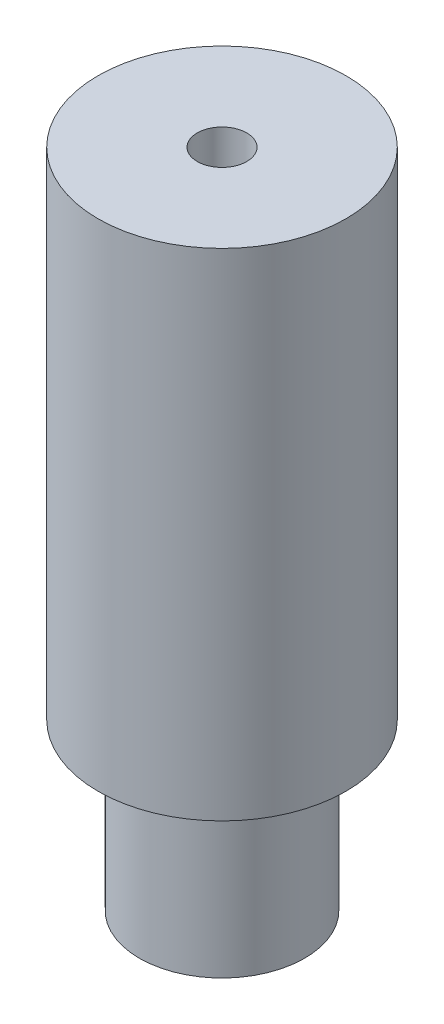
ISO-10303-21;
HEADER;
FILE_DESCRIPTION(('STEP AP214'),'2;1');
FILE_NAME('part.step','',(''),(''),'','','');
FILE_SCHEMA(('AUTOMOTIVE_DESIGN { 1 0 10303 214 1 1 1 1 }'));
ENDSEC;
DATA;
#1=APPLICATION_CONTEXT('core data for automotive mechanical design processes');
#2=APPLICATION_PROTOCOL_DEFINITION('international standard','automotive_design',2000,#1);
#3=PRODUCT_CONTEXT('',#1,'mechanical');
#4=PRODUCT('Part','Part','',(#3));
#5=PRODUCT_RELATED_PRODUCT_CATEGORY('part','',(#4));
#6=PRODUCT_DEFINITION_FORMATION('','',#4);
#7=PRODUCT_DEFINITION_CONTEXT('part definition',#1,'design');
#8=PRODUCT_DEFINITION('design','',#6,#7);
#9=PRODUCT_DEFINITION_SHAPE('','',#8);
#10=(LENGTH_UNIT() NAMED_UNIT(*) SI_UNIT(.MILLI.,.METRE.));
#11=(NAMED_UNIT(*) PLANE_ANGLE_UNIT() SI_UNIT($,.RADIAN.));
#12=(NAMED_UNIT(*) SI_UNIT($,.STERADIAN.) SOLID_ANGLE_UNIT());
#13=UNCERTAINTY_MEASURE_WITH_UNIT(LENGTH_MEASURE(1.E-05),#10,'distance_accuracy_value','');
#14=(GEOMETRIC_REPRESENTATION_CONTEXT(3) GLOBAL_UNCERTAINTY_ASSIGNED_CONTEXT((#13)) GLOBAL_UNIT_ASSIGNED_CONTEXT((#10,
#11,#12)) REPRESENTATION_CONTEXT('',''));
#15=CARTESIAN_POINT('',(0.,0.,0.));
#16=DIRECTION('',(0.,0.,1.));
#17=DIRECTION('',(1.,0.,0.));
#18=AXIS2_PLACEMENT_3D('',#15,#16,#17);
#19=CARTESIAN_POINT('',(0.,10.,0.));
#20=DIRECTION('',(0.,-1.,0.));
#21=DIRECTION('',(0.,0.,-1.));
#22=AXIS2_PLACEMENT_3D('',#19,#20,#21);
#23=CYLINDRICAL_SURFACE('',#22,5.);
#24=CARTESIAN_POINT('',(0.,10.,0.));
#25=DIRECTION('',(0.,1.,0.));
#26=DIRECTION('',(0.,0.,1.));
#27=AXIS2_PLACEMENT_3D('',#24,#25,#26);
#28=CIRCLE('',#27,5.);
#29=CARTESIAN_POINT('',(0.,10.,5.));
#30=VERTEX_POINT('',#29);
#31=EDGE_CURVE('E10',#30,#30,#28,.T.);
#32=ORIENTED_EDGE('',*,*,#31,.F.);
#33=EDGE_LOOP('',(#32));
#34=FACE_BOUND('',#33,.T.);
#35=CARTESIAN_POINT('',(0.,0.,0.));
#36=DIRECTION('',(0.,1.,0.));
#37=DIRECTION('',(0.,0.,1.));
#38=AXIS2_PLACEMENT_3D('',#35,#36,#37);
#39=CIRCLE('',#38,5.);
#40=CARTESIAN_POINT('',(0.,0.,5.));
#41=VERTEX_POINT('',#40);
#42=EDGE_CURVE('E37',#41,#41,#39,.T.);
#43=ORIENTED_EDGE('',*,*,#42,.T.);
#44=EDGE_LOOP('',(#43));
#45=FACE_BOUND('',#44,.T.);
#46=ADVANCED_FACE('F40',(#34,#45),#23,.T.);
#47=CARTESIAN_POINT('',(0.,0.,0.));
#48=DIRECTION('',(0.,1.,0.));
#49=DIRECTION('',(0.,0.,1.));
#50=AXIS2_PLACEMENT_3D('',#47,#48,#49);
#51=PLANE('',#50);
#52=CARTESIAN_POINT('',(0.,0.,0.));
#53=DIRECTION('',(0.,-1.,0.));
#54=DIRECTION('',(0.,0.,-1.));
#55=AXIS2_PLACEMENT_3D('',#52,#53,#54);
#56=CIRCLE('',#55,3.);
#57=CARTESIAN_POINT('',(0.,0.,-3.));
#58=VERTEX_POINT('',#57);
#59=EDGE_CURVE('E54',#58,#58,#56,.T.);
#60=ORIENTED_EDGE('',*,*,#59,.F.);
#61=EDGE_LOOP('',(#60));
#62=FACE_BOUND('',#61,.T.);
#63=ORIENTED_EDGE('',*,*,#42,.F.);
#64=EDGE_LOOP('',(#63));
#65=FACE_BOUND('',#64,.T.);
#66=ADVANCED_FACE('F88',(#62,#65),#51,.F.);
#67=CARTESIAN_POINT('',(0.,40.,0.));
#68=DIRECTION('',(0.,-1.,0.));
#69=DIRECTION('',(0.,0.,-1.));
#70=AXIS2_PLACEMENT_3D('',#67,#68,#69);
#71=CYLINDRICAL_SURFACE('',#70,7.5);
#72=CARTESIAN_POINT('',(0.,40.,0.));
#73=DIRECTION('',(0.,1.,0.));
#74=DIRECTION('',(0.,0.,1.));
#75=AXIS2_PLACEMENT_3D('',#72,#73,#74);
#76=CIRCLE('',#75,7.5);
#77=CARTESIAN_POINT('',(0.,40.,7.5));
#78=VERTEX_POINT('',#77);
#79=EDGE_CURVE('E50',#78,#78,#76,.T.);
#80=ORIENTED_EDGE('',*,*,#79,.F.);
#81=EDGE_LOOP('',(#80));
#82=FACE_BOUND('',#81,.T.);
#83=CARTESIAN_POINT('',(0.,10.,0.));
#84=DIRECTION('',(0.,1.,0.));
#85=DIRECTION('',(0.,0.,1.));
#86=AXIS2_PLACEMENT_3D('',#83,#84,#85);
#87=CIRCLE('',#86,7.5);
#88=CARTESIAN_POINT('',(0.,10.,7.5));
#89=VERTEX_POINT('',#88);
#90=EDGE_CURVE('E47',#89,#89,#87,.T.);
#91=ORIENTED_EDGE('',*,*,#90,.T.);
#92=EDGE_LOOP('',(#91));
#93=FACE_BOUND('',#92,.T.);
#94=ADVANCED_FACE('F76',(#82,#93),#71,.T.);
#95=CARTESIAN_POINT('',(0.,40.,0.));
#96=DIRECTION('',(0.,1.,0.));
#97=DIRECTION('',(0.,0.,1.));
#98=AXIS2_PLACEMENT_3D('',#95,#96,#97);
#99=PLANE('',#98);
#100=CARTESIAN_POINT('',(0.,40.,0.));
#101=DIRECTION('',(0.,1.,0.));
#102=DIRECTION('',(0.,0.,1.));
#103=AXIS2_PLACEMENT_3D('',#100,#101,#102);
#104=CIRCLE('',#103,1.5);
#105=CARTESIAN_POINT('',(0.,40.,1.5));
#106=VERTEX_POINT('',#105);
#107=EDGE_CURVE('E62',#106,#106,#104,.T.);
#108=ORIENTED_EDGE('',*,*,#107,.F.);
#109=EDGE_LOOP('',(#108));
#110=FACE_BOUND('',#109,.T.);
#111=ORIENTED_EDGE('',*,*,#79,.T.);
#112=EDGE_LOOP('',(#111));
#113=FACE_BOUND('',#112,.T.);
#114=ADVANCED_FACE('F77',(#110,#113),#99,.T.);
#115=CARTESIAN_POINT('',(0.,10.,0.));
#116=DIRECTION('',(0.,1.,0.));
#117=DIRECTION('',(0.,0.,1.));
#118=AXIS2_PLACEMENT_3D('',#115,#116,#117);
#119=PLANE('',#118);
#120=ORIENTED_EDGE('',*,*,#31,.T.);
#121=EDGE_LOOP('',(#120));
#122=FACE_BOUND('',#121,.T.);
#123=ORIENTED_EDGE('',*,*,#90,.F.);
#124=EDGE_LOOP('',(#123));
#125=FACE_BOUND('',#124,.T.);
#126=ADVANCED_FACE('F79',(#122,#125),#119,.F.);
#127=CARTESIAN_POINT('',(0.,20.,0.));
#128=DIRECTION('',(0.,-1.,0.));
#129=DIRECTION('',(0.,0.,-1.));
#130=AXIS2_PLACEMENT_3D('',#127,#128,#129);
#131=CYLINDRICAL_SURFACE('',#130,3.);
#132=CARTESIAN_POINT('',(0.,20.,0.));
#133=DIRECTION('',(0.,-1.,0.));
#134=DIRECTION('',(0.,0.,-1.));
#135=AXIS2_PLACEMENT_3D('',#132,#133,#134);
#136=CIRCLE('',#135,3.);
#137=CARTESIAN_POINT('',(0.,20.,-3.));
#138=VERTEX_POINT('',#137);
#139=EDGE_CURVE('E55',#138,#138,#136,.T.);
#140=ORIENTED_EDGE('',*,*,#139,.F.);
#141=EDGE_LOOP('',(#140));
#142=FACE_BOUND('',#141,.T.);
#143=ORIENTED_EDGE('',*,*,#59,.T.);
#144=EDGE_LOOP('',(#143));
#145=FACE_BOUND('',#144,.T.);
#146=ADVANCED_FACE('F93',(#142,#145),#131,.F.);
#147=CARTESIAN_POINT('',(0.,20.,0.));
#148=DIRECTION('',(0.,-1.,0.));
#149=DIRECTION('',(0.,0.,-1.));
#150=AXIS2_PLACEMENT_3D('',#147,#148,#149);
#151=PLANE('',#150);
#152=CARTESIAN_POINT('',(0.,20.,0.));
#153=DIRECTION('',(0.,1.,0.));
#154=DIRECTION('',(0.,0.,1.));
#155=AXIS2_PLACEMENT_3D('',#152,#153,#154);
#156=CIRCLE('',#155,1.5);
#157=CARTESIAN_POINT('',(0.,20.,1.5));
#158=VERTEX_POINT('',#157);
#159=EDGE_CURVE('E59',#158,#158,#156,.T.);
#160=ORIENTED_EDGE('',*,*,#159,.T.);
#161=EDGE_LOOP('',(#160));
#162=FACE_BOUND('',#161,.T.);
#163=ORIENTED_EDGE('',*,*,#139,.T.);
#164=EDGE_LOOP('',(#163));
#165=FACE_BOUND('',#164,.T.);
#166=ADVANCED_FACE('F70',(#162,#165),#151,.T.);
#167=CARTESIAN_POINT('',(0.,20.,0.));
#168=DIRECTION('',(0.,1.,0.));
#169=DIRECTION('',(0.,0.,1.));
#170=AXIS2_PLACEMENT_3D('',#167,#168,#169);
#171=CYLINDRICAL_SURFACE('',#170,1.5);
#172=ORIENTED_EDGE('',*,*,#159,.F.);
#173=EDGE_LOOP('',(#172));
#174=FACE_BOUND('',#173,.T.);
#175=ORIENTED_EDGE('',*,*,#107,.T.);
#176=EDGE_LOOP('',(#175));
#177=FACE_BOUND('',#176,.T.);
#178=ADVANCED_FACE('F69',(#174,#177),#171,.F.);
#179=CLOSED_SHELL('',(#46,#66,#94,#114,#126,#146,#166,#178));
#180=MANIFOLD_SOLID_BREP('B2',#179);
#181=ADVANCED_BREP_SHAPE_REPRESENTATION('',(#18,#180),#14);
#182=SHAPE_DEFINITION_REPRESENTATION(#9,#181);
ENDSEC;
END-ISO-10303-21;
